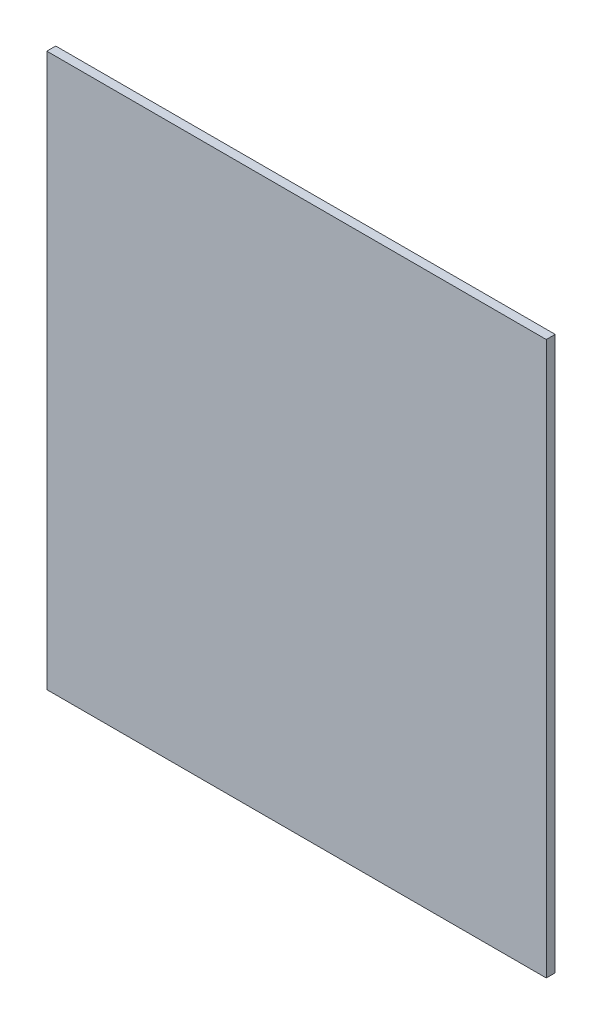
ISO-10303-21;
HEADER;
FILE_DESCRIPTION(('STEP AP214'),'2;1');
FILE_NAME('part.step','',(''),(''),'','','');
FILE_SCHEMA(('AUTOMOTIVE_DESIGN { 1 0 10303 214 1 1 1 1 }'));
ENDSEC;
DATA;
#1=APPLICATION_CONTEXT('core data for automotive mechanical design processes');
#2=APPLICATION_PROTOCOL_DEFINITION('international standard','automotive_design',2000,#1);
#3=PRODUCT_CONTEXT('',#1,'mechanical');
#4=PRODUCT('Part','Part','',(#3));
#5=PRODUCT_RELATED_PRODUCT_CATEGORY('part','',(#4));
#6=PRODUCT_DEFINITION_FORMATION('','',#4);
#7=PRODUCT_DEFINITION_CONTEXT('part definition',#1,'design');
#8=PRODUCT_DEFINITION('design','',#6,#7);
#9=PRODUCT_DEFINITION_SHAPE('','',#8);
#10=(LENGTH_UNIT() NAMED_UNIT(*) SI_UNIT(.MILLI.,.METRE.));
#11=(NAMED_UNIT(*) PLANE_ANGLE_UNIT() SI_UNIT($,.RADIAN.));
#12=(NAMED_UNIT(*) SI_UNIT($,.STERADIAN.) SOLID_ANGLE_UNIT());
#13=UNCERTAINTY_MEASURE_WITH_UNIT(LENGTH_MEASURE(1.E-05),#10,'distance_accuracy_value','');
#14=(GEOMETRIC_REPRESENTATION_CONTEXT(3) GLOBAL_UNCERTAINTY_ASSIGNED_CONTEXT((#13)) GLOBAL_UNIT_ASSIGNED_CONTEXT((#10,
#11,#12)) REPRESENTATION_CONTEXT('',''));
#15=CARTESIAN_POINT('',(0.,0.,0.));
#16=DIRECTION('',(0.,0.,1.));
#17=DIRECTION('',(1.,0.,0.));
#18=AXIS2_PLACEMENT_3D('',#15,#16,#17);
#19=CARTESIAN_POINT('',(280.,685.,140.));
#20=DIRECTION('',(-1.,0.,0.));
#21=DIRECTION('',(0.,0.,1.));
#22=AXIS2_PLACEMENT_3D('',#19,#20,#21);
#23=PLANE('',#22);
#24=DIRECTION('',(0.,-1.,0.));
#25=VECTOR('',#24,1.);
#26=CARTESIAN_POINT('',(280.,685.,150.));
#27=LINE('',#26,#25);
#28=CARTESIAN_POINT('',(280.,685.,150.));
#29=VERTEX_POINT('',#28);
#30=CARTESIAN_POINT('',(280.,65.0000000000002,150.));
#31=VERTEX_POINT('',#30);
#32=EDGE_CURVE('E102',#29,#31,#27,.T.);
#33=ORIENTED_EDGE('',*,*,#32,.T.);
#34=DIRECTION('',(0.,0.,1.));
#35=VECTOR('',#34,1.);
#36=CARTESIAN_POINT('',(280.,65.0000000000002,140.));
#37=LINE('',#36,#35);
#38=CARTESIAN_POINT('',(280.,65.0000000000002,140.));
#39=VERTEX_POINT('',#38);
#40=EDGE_CURVE('E11',#39,#31,#37,.T.);
#41=ORIENTED_EDGE('',*,*,#40,.F.);
#42=DIRECTION('',(0.,-1.,0.));
#43=VECTOR('',#42,1.);
#44=CARTESIAN_POINT('',(280.,685.,140.));
#45=LINE('',#44,#43);
#46=CARTESIAN_POINT('',(280.,685.,140.));
#47=VERTEX_POINT('',#46);
#48=EDGE_CURVE('E90',#47,#39,#45,.T.);
#49=ORIENTED_EDGE('',*,*,#48,.F.);
#50=DIRECTION('',(0.,0.,1.));
#51=VECTOR('',#50,1.);
#52=CARTESIAN_POINT('',(280.,685.,140.));
#53=LINE('',#52,#51);
#54=EDGE_CURVE('E98',#47,#29,#53,.T.);
#55=ORIENTED_EDGE('',*,*,#54,.T.);
#56=EDGE_LOOP('',(#33,#41,#49,#55));
#57=FACE_BOUND('',#56,.T.);
#58=ADVANCED_FACE('F39',(#57),#23,.F.);
#59=CARTESIAN_POINT('',(280.,65.0000000000002,140.));
#60=DIRECTION('',(0.,1.,0.));
#61=DIRECTION('',(0.,0.,1.));
#62=AXIS2_PLACEMENT_3D('',#59,#60,#61);
#63=PLANE('',#62);
#64=DIRECTION('',(-1.,0.,0.));
#65=VECTOR('',#64,1.);
#66=CARTESIAN_POINT('',(280.,65.0000000000002,150.));
#67=LINE('',#66,#65);
#68=CARTESIAN_POINT('',(-280.,65.0000000000002,150.));
#69=VERTEX_POINT('',#68);
#70=EDGE_CURVE('E94',#31,#69,#67,.T.);
#71=ORIENTED_EDGE('',*,*,#70,.T.);
#72=DIRECTION('',(0.,0.,1.));
#73=VECTOR('',#72,1.);
#74=CARTESIAN_POINT('',(-280.,65.0000000000002,140.));
#75=LINE('',#74,#73);
#76=CARTESIAN_POINT('',(-280.,65.0000000000002,140.));
#77=VERTEX_POINT('',#76);
#78=EDGE_CURVE('E47',#77,#69,#75,.T.);
#79=ORIENTED_EDGE('',*,*,#78,.F.);
#80=DIRECTION('',(-1.,0.,0.));
#81=VECTOR('',#80,1.);
#82=CARTESIAN_POINT('',(280.,65.0000000000002,140.));
#83=LINE('',#82,#81);
#84=EDGE_CURVE('E85',#39,#77,#83,.T.);
#85=ORIENTED_EDGE('',*,*,#84,.F.);
#86=ORIENTED_EDGE('',*,*,#40,.T.);
#87=EDGE_LOOP('',(#71,#79,#85,#86));
#88=FACE_BOUND('',#87,.T.);
#89=ADVANCED_FACE('F93',(#88),#63,.F.);
#90=CARTESIAN_POINT('',(-280.,65.0000000000002,140.));
#91=DIRECTION('',(1.,0.,0.));
#92=DIRECTION('',(0.,0.,-1.));
#93=AXIS2_PLACEMENT_3D('',#90,#91,#92);
#94=PLANE('',#93);
#95=DIRECTION('',(0.,1.,0.));
#96=VECTOR('',#95,1.);
#97=CARTESIAN_POINT('',(-280.,65.0000000000002,150.));
#98=LINE('',#97,#96);
#99=CARTESIAN_POINT('',(-280.,685.,150.));
#100=VERTEX_POINT('',#99);
#101=EDGE_CURVE('E72',#69,#100,#98,.T.);
#102=ORIENTED_EDGE('',*,*,#101,.T.);
#103=DIRECTION('',(0.,0.,1.));
#104=VECTOR('',#103,1.);
#105=CARTESIAN_POINT('',(-280.,685.,140.));
#106=LINE('',#105,#104);
#107=CARTESIAN_POINT('',(-280.,685.,140.));
#108=VERTEX_POINT('',#107);
#109=EDGE_CURVE('E95',#108,#100,#106,.T.);
#110=ORIENTED_EDGE('',*,*,#109,.F.);
#111=DIRECTION('',(0.,1.,0.));
#112=VECTOR('',#111,1.);
#113=CARTESIAN_POINT('',(-280.,65.0000000000002,140.));
#114=LINE('',#113,#112);
#115=EDGE_CURVE('E88',#77,#108,#114,.T.);
#116=ORIENTED_EDGE('',*,*,#115,.F.);
#117=ORIENTED_EDGE('',*,*,#78,.T.);
#118=EDGE_LOOP('',(#102,#110,#116,#117));
#119=FACE_BOUND('',#118,.T.);
#120=ADVANCED_FACE('F96',(#119),#94,.F.);
#121=CARTESIAN_POINT('',(-280.,685.,140.));
#122=DIRECTION('',(0.,-1.,0.));
#123=DIRECTION('',(0.,0.,-1.));
#124=AXIS2_PLACEMENT_3D('',#121,#122,#123);
#125=PLANE('',#124);
#126=DIRECTION('',(1.,0.,0.));
#127=VECTOR('',#126,1.);
#128=CARTESIAN_POINT('',(-280.,685.,150.));
#129=LINE('',#128,#127);
#130=EDGE_CURVE('E78',#100,#29,#129,.T.);
#131=ORIENTED_EDGE('',*,*,#130,.T.);
#132=ORIENTED_EDGE('',*,*,#54,.F.);
#133=DIRECTION('',(1.,0.,0.));
#134=VECTOR('',#133,1.);
#135=CARTESIAN_POINT('',(-280.,685.,140.));
#136=LINE('',#135,#134);
#137=EDGE_CURVE('E55',#108,#47,#136,.T.);
#138=ORIENTED_EDGE('',*,*,#137,.F.);
#139=ORIENTED_EDGE('',*,*,#109,.T.);
#140=EDGE_LOOP('',(#131,#132,#138,#139));
#141=FACE_BOUND('',#140,.T.);
#142=ADVANCED_FACE('F109',(#141),#125,.F.);
#143=CARTESIAN_POINT('',(0.,0.,140.));
#144=DIRECTION('',(0.,0.,-1.));
#145=DIRECTION('',(-1.,0.,0.));
#146=AXIS2_PLACEMENT_3D('',#143,#144,#145);
#147=PLANE('',#146);
#148=ORIENTED_EDGE('',*,*,#48,.T.);
#149=ORIENTED_EDGE('',*,*,#84,.T.);
#150=ORIENTED_EDGE('',*,*,#115,.T.);
#151=ORIENTED_EDGE('',*,*,#137,.T.);
#152=EDGE_LOOP('',(#148,#149,#150,#151));
#153=FACE_BOUND('',#152,.T.);
#154=ADVANCED_FACE('F86',(#153),#147,.T.);
#155=CARTESIAN_POINT('',(0.,0.,150.));
#156=DIRECTION('',(0.,0.,-1.));
#157=DIRECTION('',(-1.,0.,0.));
#158=AXIS2_PLACEMENT_3D('',#155,#156,#157);
#159=PLANE('',#158);
#160=ORIENTED_EDGE('',*,*,#32,.F.);
#161=ORIENTED_EDGE('',*,*,#130,.F.);
#162=ORIENTED_EDGE('',*,*,#101,.F.);
#163=ORIENTED_EDGE('',*,*,#70,.F.);
#164=EDGE_LOOP('',(#160,#161,#162,#163));
#165=FACE_BOUND('',#164,.T.);
#166=ADVANCED_FACE('F112',(#165),#159,.F.);
#167=CLOSED_SHELL('',(#58,#89,#120,#142,#154,#166));
#168=MANIFOLD_SOLID_BREP('B2',#167);
#169=ADVANCED_BREP_SHAPE_REPRESENTATION('',(#18,#168),#14);
#170=SHAPE_DEFINITION_REPRESENTATION(#9,#169);
ENDSEC;
END-ISO-10303-21;
